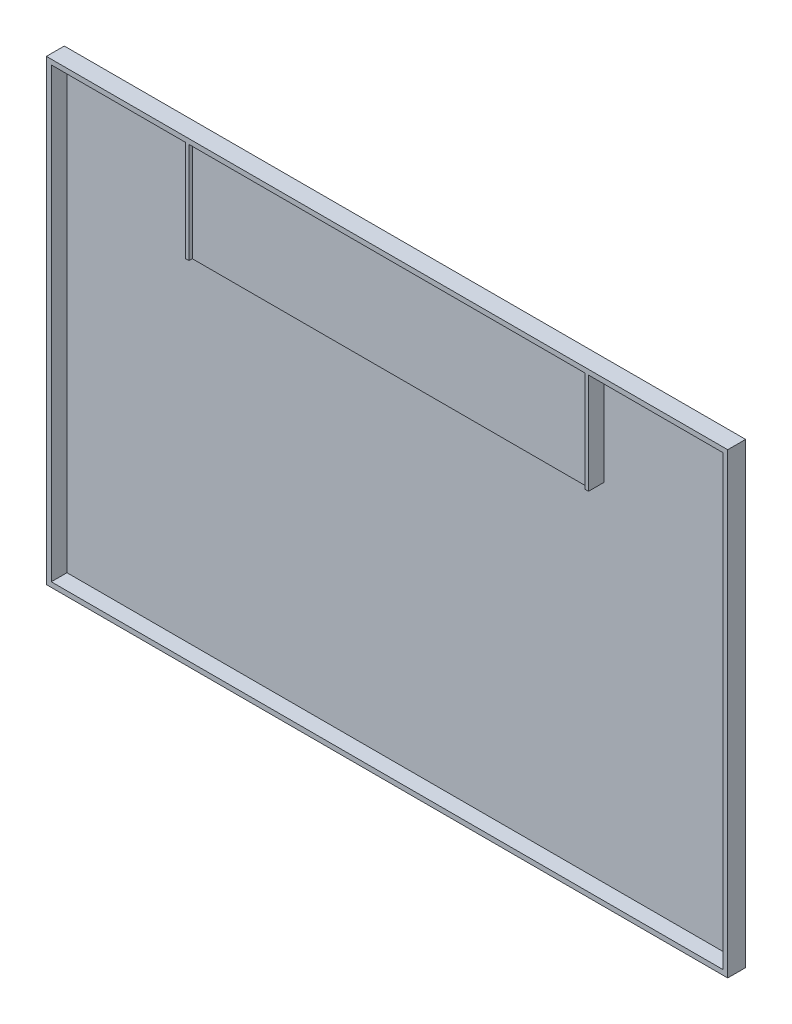
ISO-10303-21;
HEADER;
FILE_DESCRIPTION(('STEP AP214'),'2;1');
FILE_NAME('part.step','',(''),(''),'','','');
FILE_SCHEMA(('AUTOMOTIVE_DESIGN { 1 0 10303 214 1 1 1 1 }'));
ENDSEC;
DATA;
#1=APPLICATION_CONTEXT('core data for automotive mechanical design processes');
#2=APPLICATION_PROTOCOL_DEFINITION('international standard','automotive_design',2000,#1);
#3=PRODUCT_CONTEXT('',#1,'mechanical');
#4=PRODUCT('Part','Part','',(#3));
#5=PRODUCT_RELATED_PRODUCT_CATEGORY('part','',(#4));
#6=PRODUCT_DEFINITION_FORMATION('','',#4);
#7=PRODUCT_DEFINITION_CONTEXT('part definition',#1,'design');
#8=PRODUCT_DEFINITION('design','',#6,#7);
#9=PRODUCT_DEFINITION_SHAPE('','',#8);
#10=(LENGTH_UNIT() NAMED_UNIT(*) SI_UNIT(.MILLI.,.METRE.));
#11=(NAMED_UNIT(*) PLANE_ANGLE_UNIT() SI_UNIT($,.RADIAN.));
#12=(NAMED_UNIT(*) SI_UNIT($,.STERADIAN.) SOLID_ANGLE_UNIT());
#13=UNCERTAINTY_MEASURE_WITH_UNIT(LENGTH_MEASURE(1.E-05),#10,'distance_accuracy_value','');
#14=(GEOMETRIC_REPRESENTATION_CONTEXT(3) GLOBAL_UNCERTAINTY_ASSIGNED_CONTEXT((#13)) GLOBAL_UNIT_ASSIGNED_CONTEXT((#10,
#11,#12)) REPRESENTATION_CONTEXT('',''));
#15=CARTESIAN_POINT('',(0.,0.,0.));
#16=DIRECTION('',(0.,0.,1.));
#17=DIRECTION('',(1.,0.,0.));
#18=AXIS2_PLACEMENT_3D('',#15,#16,#17);
#19=CARTESIAN_POINT('',(0.,0.,80.));
#20=DIRECTION('',(0.,-1.,0.));
#21=DIRECTION('',(0.,0.,-1.));
#22=AXIS2_PLACEMENT_3D('',#19,#20,#21);
#23=PLANE('',#22);
#24=DIRECTION('',(-1.,0.,0.));
#25=VECTOR('',#24,1.);
#26=CARTESIAN_POINT('',(0.,0.,80.));
#27=LINE('',#26,#25);
#28=CARTESIAN_POINT('',(3000.,0.,80.));
#29=VERTEX_POINT('',#28);
#30=CARTESIAN_POINT('',(2400.00000000003,0.,80.));
#31=VERTEX_POINT('',#30);
#32=EDGE_CURVE('E223',#29,#31,#27,.T.);
#33=ORIENTED_EDGE('',*,*,#32,.T.);
#34=DIRECTION('',(0.,0.,-1.));
#35=VECTOR('',#34,1.);
#36=CARTESIAN_POINT('',(2400.00000000003,-8.10462807976364E-12,65.));
#37=LINE('',#36,#35);
#38=CARTESIAN_POINT('',(2400.00000000003,-8.10462807976364E-12,10.));
#39=VERTEX_POINT('',#38);
#40=EDGE_CURVE('E165',#31,#39,#37,.T.);
#41=ORIENTED_EDGE('',*,*,#40,.T.);
#42=DIRECTION('',(1.,0.,0.));
#43=VECTOR('',#42,1.);
#44=CARTESIAN_POINT('',(0.,0.,10.));
#45=LINE('',#44,#43);
#46=CARTESIAN_POINT('',(3000.,0.,9.99999999999999));
#47=VERTEX_POINT('',#46);
#48=EDGE_CURVE('E250',#39,#47,#45,.T.);
#49=ORIENTED_EDGE('',*,*,#48,.T.);
#50=DIRECTION('',(0.,0.,-1.));
#51=VECTOR('',#50,1.);
#52=CARTESIAN_POINT('',(3000.,0.,80.));
#53=LINE('',#52,#51);
#54=EDGE_CURVE('E229',#29,#47,#53,.T.);
#55=ORIENTED_EDGE('',*,*,#54,.F.);
#56=EDGE_LOOP('',(#33,#41,#49,#55));
#57=FACE_BOUND('',#56,.T.);
#58=ADVANCED_FACE('F42',(#57),#23,.T.);
#59=DIRECTION('',(-1.,0.,0.));
#60=VECTOR('',#59,1.);
#61=CARTESIAN_POINT('',(600.000000000028,-8.10462807976364E-12,65.));
#62=LINE('',#61,#60);
#63=CARTESIAN_POINT('',(2385.00000000003,-8.10462807976364E-12,65.));
#64=VERTEX_POINT('',#63);
#65=CARTESIAN_POINT('',(615.000000000028,0.,65.));
#66=VERTEX_POINT('',#65);
#67=EDGE_CURVE('E204',#64,#66,#62,.T.);
#68=ORIENTED_EDGE('',*,*,#67,.F.);
#69=DIRECTION('',(0.,0.,-1.));
#70=VECTOR('',#69,1.);
#71=CARTESIAN_POINT('',(2385.00000000003,0.,80.));
#72=LINE('',#71,#70);
#73=CARTESIAN_POINT('',(2385.00000000003,0.,80.));
#74=VERTEX_POINT('',#73);
#75=EDGE_CURVE('E64',#74,#64,#72,.T.);
#76=ORIENTED_EDGE('',*,*,#75,.F.);
#77=CARTESIAN_POINT('',(615.000000000028,0.,80.));
#78=VERTEX_POINT('',#77);
#79=EDGE_CURVE('E226',#74,#78,#27,.T.);
#80=ORIENTED_EDGE('',*,*,#79,.T.);
#81=DIRECTION('',(0.,0.,-1.));
#82=VECTOR('',#81,1.);
#83=CARTESIAN_POINT('',(615.000000000028,0.,80.));
#84=LINE('',#83,#82);
#85=EDGE_CURVE('E194',#78,#66,#84,.T.);
#86=ORIENTED_EDGE('',*,*,#85,.T.);
#87=EDGE_LOOP('',(#68,#76,#80,#86));
#88=FACE_BOUND('',#87,.T.);
#89=ADVANCED_FACE('F311',(#88),#23,.T.);
#90=CARTESIAN_POINT('',(0.,0.,65.));
#91=DIRECTION('',(0.,0.,1.));
#92=DIRECTION('',(1.,0.,0.));
#93=AXIS2_PLACEMENT_3D('',#90,#91,#92);
#94=PLANE('',#93);
#95=DIRECTION('',(1.,0.,0.));
#96=VECTOR('',#95,1.);
#97=CARTESIAN_POINT('',(600.000000000028,-450.000000000008,65.));
#98=LINE('',#97,#96);
#99=CARTESIAN_POINT('',(615.000000000028,-450.000000000008,65.));
#100=VERTEX_POINT('',#99);
#101=CARTESIAN_POINT('',(2385.00000000003,-450.000000000008,65.));
#102=VERTEX_POINT('',#101);
#103=EDGE_CURVE('E202',#100,#102,#98,.T.);
#104=ORIENTED_EDGE('',*,*,#103,.T.);
#105=DIRECTION('',(0.,-1.,0.));
#106=VECTOR('',#105,1.);
#107=CARTESIAN_POINT('',(2385.00000000003,-450.000000000008,65.));
#108=LINE('',#107,#106);
#109=EDGE_CURVE('E57',#64,#102,#108,.T.);
#110=ORIENTED_EDGE('',*,*,#109,.F.);
#111=ORIENTED_EDGE('',*,*,#67,.T.);
#112=DIRECTION('',(0.,1.,0.));
#113=VECTOR('',#112,1.);
#114=CARTESIAN_POINT('',(615.000000000028,-450.000000000008,65.));
#115=LINE('',#114,#113);
#116=EDGE_CURVE('E182',#100,#66,#115,.T.);
#117=ORIENTED_EDGE('',*,*,#116,.F.);
#118=EDGE_LOOP('',(#104,#110,#111,#117));
#119=FACE_BOUND('',#118,.T.);
#120=ADVANCED_FACE('F319',(#119),#94,.T.);
#121=DIRECTION('',(0.,0.,-1.));
#122=VECTOR('',#121,1.);
#123=CARTESIAN_POINT('',(600.000000000028,-8.10462807976364E-12,65.));
#124=LINE('',#123,#122);
#125=CARTESIAN_POINT('',(600.000000000028,0.,80.));
#126=VERTEX_POINT('',#125);
#127=CARTESIAN_POINT('',(600.000000000028,-8.10462807976364E-12,10.));
#128=VERTEX_POINT('',#127);
#129=EDGE_CURVE('E207',#126,#128,#124,.T.);
#130=ORIENTED_EDGE('',*,*,#129,.F.);
#131=CARTESIAN_POINT('',(0.,0.,80.));
#132=VERTEX_POINT('',#131);
#133=EDGE_CURVE('E222',#126,#132,#27,.T.);
#134=ORIENTED_EDGE('',*,*,#133,.T.);
#135=DIRECTION('',(0.,0.,-1.));
#136=VECTOR('',#135,1.);
#137=CARTESIAN_POINT('',(0.,0.,80.));
#138=LINE('',#137,#136);
#139=CARTESIAN_POINT('',(0.,0.,10.));
#140=VERTEX_POINT('',#139);
#141=EDGE_CURVE('E225',#132,#140,#138,.T.);
#142=ORIENTED_EDGE('',*,*,#141,.T.);
#143=EDGE_CURVE('E251',#140,#128,#45,.T.);
#144=ORIENTED_EDGE('',*,*,#143,.T.);
#145=EDGE_LOOP('',(#130,#134,#142,#144));
#146=FACE_BOUND('',#145,.T.);
#147=ADVANCED_FACE('F314',(#146),#23,.T.);
#148=CARTESIAN_POINT('',(0.,0.,10.));
#149=DIRECTION('',(0.,0.,1.));
#150=DIRECTION('',(1.,0.,0.));
#151=AXIS2_PLACEMENT_3D('',#148,#149,#150);
#152=PLANE('',#151);
#153=DIRECTION('',(1.,0.,0.));
#154=VECTOR('',#153,1.);
#155=CARTESIAN_POINT('',(600.000000000028,-450.000000000008,10.));
#156=LINE('',#155,#154);
#157=CARTESIAN_POINT('',(600.000000000028,-450.000000000008,10.));
#158=VERTEX_POINT('',#157);
#159=CARTESIAN_POINT('',(2400.00000000003,-450.000000000008,10.));
#160=VERTEX_POINT('',#159);
#161=EDGE_CURVE('E160',#158,#160,#156,.T.);
#162=ORIENTED_EDGE('',*,*,#161,.F.);
#163=DIRECTION('',(0.,-1.,0.));
#164=VECTOR('',#163,1.);
#165=CARTESIAN_POINT('',(600.000000000028,-8.10462807976364E-12,10.));
#166=LINE('',#165,#164);
#167=EDGE_CURVE('E201',#128,#158,#166,.T.);
#168=ORIENTED_EDGE('',*,*,#167,.F.);
#169=ORIENTED_EDGE('',*,*,#143,.F.);
#170=DIRECTION('',(0.,1.,0.));
#171=VECTOR('',#170,1.);
#172=CARTESIAN_POINT('',(0.,0.,10.));
#173=LINE('',#172,#171);
#174=CARTESIAN_POINT('',(2.44929357282144E-13,-2000.,10.));
#175=VERTEX_POINT('',#174);
#176=EDGE_CURVE('E260',#175,#140,#173,.T.);
#177=ORIENTED_EDGE('',*,*,#176,.F.);
#178=DIRECTION('',(-1.,0.,0.));
#179=VECTOR('',#178,1.);
#180=CARTESIAN_POINT('',(0.,-2000.,10.));
#181=LINE('',#180,#179);
#182=CARTESIAN_POINT('',(3000.,-2000.,10.));
#183=VERTEX_POINT('',#182);
#184=EDGE_CURVE('E257',#183,#175,#181,.T.);
#185=ORIENTED_EDGE('',*,*,#184,.F.);
#186=DIRECTION('',(0.,-1.,0.));
#187=VECTOR('',#186,1.);
#188=CARTESIAN_POINT('',(3000.,6.66133814775094E-13,10.));
#189=LINE('',#188,#187);
#190=EDGE_CURVE('E254',#47,#183,#189,.T.);
#191=ORIENTED_EDGE('',*,*,#190,.F.);
#192=ORIENTED_EDGE('',*,*,#48,.F.);
#193=DIRECTION('',(0.,1.,0.));
#194=VECTOR('',#193,1.);
#195=CARTESIAN_POINT('',(2400.00000000003,-8.10462807976364E-12,10.));
#196=LINE('',#195,#194);
#197=EDGE_CURVE('E205',#160,#39,#196,.T.);
#198=ORIENTED_EDGE('',*,*,#197,.F.);
#199=EDGE_LOOP('',(#162,#168,#169,#177,#185,#191,#192,#198));
#200=FACE_BOUND('',#199,.T.);
#201=ADVANCED_FACE('F323',(#200),#152,.T.);
#202=CARTESIAN_POINT('',(3022.,1.31314832893042E-12,10.));
#203=DIRECTION('',(1.,0.,0.));
#204=DIRECTION('',(0.,1.,0.));
#205=AXIS2_PLACEMENT_3D('',#202,#203,#204);
#206=PLANE('',#205);
#207=DIRECTION('',(0.,-1.,0.));
#208=VECTOR('',#207,1.);
#209=CARTESIAN_POINT('',(3022.,1.31314832893042E-12,0.));
#210=LINE('',#209,#208);
#211=CARTESIAN_POINT('',(3022.,22.,0.));
#212=VERTEX_POINT('',#211);
#213=CARTESIAN_POINT('',(3022.,-2022.,0.));
#214=VERTEX_POINT('',#213);
#215=EDGE_CURVE('E263',#212,#214,#210,.T.);
#216=ORIENTED_EDGE('',*,*,#215,.F.);
#217=DIRECTION('',(0.,0.,-1.));
#218=VECTOR('',#217,1.);
#219=CARTESIAN_POINT('',(3022.,22.,10.));
#220=LINE('',#219,#218);
#221=CARTESIAN_POINT('',(3022.,22.,80.));
#222=VERTEX_POINT('',#221);
#223=EDGE_CURVE('E11',#222,#212,#220,.T.);
#224=ORIENTED_EDGE('',*,*,#223,.F.);
#225=DIRECTION('',(0.,1.,0.));
#226=VECTOR('',#225,1.);
#227=CARTESIAN_POINT('',(3022.,22.,80.));
#228=LINE('',#227,#226);
#229=CARTESIAN_POINT('',(3022.,-2022.,80.));
#230=VERTEX_POINT('',#229);
#231=EDGE_CURVE('E244',#230,#222,#228,.T.);
#232=ORIENTED_EDGE('',*,*,#231,.F.);
#233=DIRECTION('',(0.,0.,-1.));
#234=VECTOR('',#233,1.);
#235=CARTESIAN_POINT('',(3022.,-2022.,10.));
#236=LINE('',#235,#234);
#237=EDGE_CURVE('E274',#230,#214,#236,.T.);
#238=ORIENTED_EDGE('',*,*,#237,.T.);
#239=EDGE_LOOP('',(#216,#224,#232,#238));
#240=FACE_BOUND('',#239,.T.);
#241=ADVANCED_FACE('F44',(#240),#206,.T.);
#242=CARTESIAN_POINT('',(0.,22.,10.));
#243=DIRECTION('',(0.,1.,0.));
#244=DIRECTION('',(-1.,0.,0.));
#245=AXIS2_PLACEMENT_3D('',#242,#243,#244);
#246=PLANE('',#245);
#247=DIRECTION('',(1.,0.,0.));
#248=VECTOR('',#247,1.);
#249=CARTESIAN_POINT('',(0.,22.,0.));
#250=LINE('',#249,#248);
#251=CARTESIAN_POINT('',(-22.,22.,0.));
#252=VERTEX_POINT('',#251);
#253=EDGE_CURVE('E266',#252,#212,#250,.T.);
#254=ORIENTED_EDGE('',*,*,#253,.F.);
#255=DIRECTION('',(0.,0.,-1.));
#256=VECTOR('',#255,1.);
#257=CARTESIAN_POINT('',(-22.,22.,10.));
#258=LINE('',#257,#256);
#259=CARTESIAN_POINT('',(-22.,22.,80.));
#260=VERTEX_POINT('',#259);
#261=EDGE_CURVE('E50',#260,#252,#258,.T.);
#262=ORIENTED_EDGE('',*,*,#261,.F.);
#263=DIRECTION('',(-1.,0.,0.));
#264=VECTOR('',#263,1.);
#265=CARTESIAN_POINT('',(-22.,22.,80.));
#266=LINE('',#265,#264);
#267=EDGE_CURVE('E247',#222,#260,#266,.T.);
#268=ORIENTED_EDGE('',*,*,#267,.F.);
#269=ORIENTED_EDGE('',*,*,#223,.T.);
#270=EDGE_LOOP('',(#254,#262,#268,#269));
#271=FACE_BOUND('',#270,.T.);
#272=ADVANCED_FACE('F288',(#271),#246,.T.);
#273=CARTESIAN_POINT('',(-22.,0.,10.));
#274=DIRECTION('',(1.,0.,0.));
#275=DIRECTION('',(0.,1.,0.));
#276=AXIS2_PLACEMENT_3D('',#273,#274,#275);
#277=PLANE('',#276);
#278=DIRECTION('',(0.,-1.,0.));
#279=VECTOR('',#278,1.);
#280=CARTESIAN_POINT('',(-22.,0.,0.));
#281=LINE('',#280,#279);
#282=CARTESIAN_POINT('',(-21.9999999999998,-2022.,0.));
#283=VERTEX_POINT('',#282);
#284=EDGE_CURVE('E269',#252,#283,#281,.T.);
#285=ORIENTED_EDGE('',*,*,#284,.T.);
#286=DIRECTION('',(0.,0.,-1.));
#287=VECTOR('',#286,1.);
#288=CARTESIAN_POINT('',(-21.9999999999998,-2022.,10.));
#289=LINE('',#288,#287);
#290=CARTESIAN_POINT('',(-21.9999999999998,-2022.,80.));
#291=VERTEX_POINT('',#290);
#292=EDGE_CURVE('E276',#291,#283,#289,.T.);
#293=ORIENTED_EDGE('',*,*,#292,.F.);
#294=DIRECTION('',(0.,-1.,0.));
#295=VECTOR('',#294,1.);
#296=CARTESIAN_POINT('',(-22.,22.,80.));
#297=LINE('',#296,#295);
#298=EDGE_CURVE('E238',#260,#291,#297,.T.);
#299=ORIENTED_EDGE('',*,*,#298,.F.);
#300=ORIENTED_EDGE('',*,*,#261,.T.);
#301=EDGE_LOOP('',(#285,#293,#299,#300));
#302=FACE_BOUND('',#301,.T.);
#303=ADVANCED_FACE('F281',(#302),#277,.F.);
#304=CARTESIAN_POINT('',(0.,-2022.,10.));
#305=DIRECTION('',(0.,1.,0.));
#306=DIRECTION('',(0.,0.,1.));
#307=AXIS2_PLACEMENT_3D('',#304,#305,#306);
#308=PLANE('',#307);
#309=DIRECTION('',(1.,0.,0.));
#310=VECTOR('',#309,1.);
#311=CARTESIAN_POINT('',(0.,-2022.,0.));
#312=LINE('',#311,#310);
#313=EDGE_CURVE('E271',#283,#214,#312,.T.);
#314=ORIENTED_EDGE('',*,*,#313,.T.);
#315=ORIENTED_EDGE('',*,*,#237,.F.);
#316=DIRECTION('',(1.,0.,0.));
#317=VECTOR('',#316,1.);
#318=CARTESIAN_POINT('',(-21.9999999999998,-2022.,80.));
#319=LINE('',#318,#317);
#320=EDGE_CURVE('E241',#291,#230,#319,.T.);
#321=ORIENTED_EDGE('',*,*,#320,.F.);
#322=ORIENTED_EDGE('',*,*,#292,.T.);
#323=EDGE_LOOP('',(#314,#315,#321,#322));
#324=FACE_BOUND('',#323,.T.);
#325=ADVANCED_FACE('F294',(#324),#308,.F.);
#326=CARTESIAN_POINT('',(0.,0.,0.));
#327=DIRECTION('',(0.,0.,1.));
#328=DIRECTION('',(1.,0.,0.));
#329=AXIS2_PLACEMENT_3D('',#326,#327,#328);
#330=PLANE('',#329);
#331=ORIENTED_EDGE('',*,*,#215,.T.);
#332=ORIENTED_EDGE('',*,*,#313,.F.);
#333=ORIENTED_EDGE('',*,*,#284,.F.);
#334=ORIENTED_EDGE('',*,*,#253,.T.);
#335=EDGE_LOOP('',(#331,#332,#333,#334));
#336=FACE_BOUND('',#335,.T.);
#337=ADVANCED_FACE('F287',(#336),#330,.F.);
#338=CARTESIAN_POINT('',(0.,0.,80.));
#339=DIRECTION('',(0.,0.,1.));
#340=DIRECTION('',(1.,0.,0.));
#341=AXIS2_PLACEMENT_3D('',#338,#339,#340);
#342=PLANE('',#341);
#343=ORIENTED_EDGE('',*,*,#298,.T.);
#344=ORIENTED_EDGE('',*,*,#320,.T.);
#345=ORIENTED_EDGE('',*,*,#231,.T.);
#346=ORIENTED_EDGE('',*,*,#267,.T.);
#347=EDGE_LOOP('',(#343,#344,#345,#346));
#348=FACE_BOUND('',#347,.T.);
#349=DIRECTION('',(1.,0.,0.));
#350=VECTOR('',#349,1.);
#351=CARTESIAN_POINT('',(2.44929359829471E-13,-2000.,80.));
#352=LINE('',#351,#350);
#353=CARTESIAN_POINT('',(2.44929359829471E-13,-2000.,80.));
#354=VERTEX_POINT('',#353);
#355=CARTESIAN_POINT('',(3000.,-2000.,80.));
#356=VERTEX_POINT('',#355);
#357=EDGE_CURVE('E217',#354,#356,#352,.T.);
#358=ORIENTED_EDGE('',*,*,#357,.F.);
#359=DIRECTION('',(0.,-1.,0.));
#360=VECTOR('',#359,1.);
#361=CARTESIAN_POINT('',(0.,0.,80.));
#362=LINE('',#361,#360);
#363=EDGE_CURVE('E215',#132,#354,#362,.T.);
#364=ORIENTED_EDGE('',*,*,#363,.F.);
#365=ORIENTED_EDGE('',*,*,#133,.F.);
#366=DIRECTION('',(0.,-1.,0.));
#367=VECTOR('',#366,1.);
#368=CARTESIAN_POINT('',(600.000000000028,-450.000000000008,80.));
#369=LINE('',#368,#367);
#370=CARTESIAN_POINT('',(600.000000000028,-450.000000000008,80.));
#371=VERTEX_POINT('',#370);
#372=EDGE_CURVE('E186',#126,#371,#369,.T.);
#373=ORIENTED_EDGE('',*,*,#372,.T.);
#374=DIRECTION('',(1.,0.,0.));
#375=VECTOR('',#374,1.);
#376=CARTESIAN_POINT('',(600.000000000028,-450.000000000008,80.));
#377=LINE('',#376,#375);
#378=CARTESIAN_POINT('',(615.000000000028,-450.000000000008,80.));
#379=VERTEX_POINT('',#378);
#380=EDGE_CURVE('E189',#371,#379,#377,.T.);
#381=ORIENTED_EDGE('',*,*,#380,.T.);
#382=DIRECTION('',(0.,1.,0.));
#383=VECTOR('',#382,1.);
#384=CARTESIAN_POINT('',(615.000000000028,-450.000000000008,80.));
#385=LINE('',#384,#383);
#386=EDGE_CURVE('E191',#379,#78,#385,.T.);
#387=ORIENTED_EDGE('',*,*,#386,.T.);
#388=ORIENTED_EDGE('',*,*,#79,.F.);
#389=DIRECTION('',(0.,-1.,0.));
#390=VECTOR('',#389,1.);
#391=CARTESIAN_POINT('',(2385.00000000003,-450.000000000008,80.));
#392=LINE('',#391,#390);
#393=CARTESIAN_POINT('',(2385.00000000003,-450.000000000008,80.));
#394=VERTEX_POINT('',#393);
#395=EDGE_CURVE('E174',#74,#394,#392,.T.);
#396=ORIENTED_EDGE('',*,*,#395,.T.);
#397=DIRECTION('',(1.,0.,0.));
#398=VECTOR('',#397,1.);
#399=CARTESIAN_POINT('',(2400.00000000003,-450.000000000008,80.));
#400=LINE('',#399,#398);
#401=CARTESIAN_POINT('',(2400.00000000003,-450.000000000008,80.));
#402=VERTEX_POINT('',#401);
#403=EDGE_CURVE('E158',#394,#402,#400,.T.);
#404=ORIENTED_EDGE('',*,*,#403,.T.);
#405=DIRECTION('',(0.,1.,0.));
#406=VECTOR('',#405,1.);
#407=CARTESIAN_POINT('',(2400.00000000003,-450.000000000008,80.));
#408=LINE('',#407,#406);
#409=EDGE_CURVE('E172',#402,#31,#408,.T.);
#410=ORIENTED_EDGE('',*,*,#409,.T.);
#411=ORIENTED_EDGE('',*,*,#32,.F.);
#412=DIRECTION('',(0.,1.,0.));
#413=VECTOR('',#412,1.);
#414=CARTESIAN_POINT('',(3000.,0.,80.));
#415=LINE('',#414,#413);
#416=EDGE_CURVE('E219',#356,#29,#415,.T.);
#417=ORIENTED_EDGE('',*,*,#416,.F.);
#418=EDGE_LOOP('',(#358,#364,#365,#373,#381,#387,#388,#396,#404,#410,#411,#417));
#419=FACE_BOUND('',#418,.T.);
#420=ADVANCED_FACE('F170',(#348,#419),#342,.T.);
#421=CARTESIAN_POINT('',(0.,0.,80.));
#422=DIRECTION('',(1.,0.,0.));
#423=DIRECTION('',(0.,1.,0.));
#424=AXIS2_PLACEMENT_3D('',#421,#422,#423);
#425=PLANE('',#424);
#426=DIRECTION('',(0.,0.,-1.));
#427=VECTOR('',#426,1.);
#428=CARTESIAN_POINT('',(2.44929359829471E-13,-2000.,80.));
#429=LINE('',#428,#427);
#430=EDGE_CURVE('E235',#354,#175,#429,.T.);
#431=ORIENTED_EDGE('',*,*,#430,.T.);
#432=ORIENTED_EDGE('',*,*,#176,.T.);
#433=ORIENTED_EDGE('',*,*,#141,.F.);
#434=ORIENTED_EDGE('',*,*,#363,.T.);
#435=EDGE_LOOP('',(#431,#432,#433,#434));
#436=FACE_BOUND('',#435,.T.);
#437=ADVANCED_FACE('F297',(#436),#425,.T.);
#438=CARTESIAN_POINT('',(2.44929359829471E-13,-2000.,80.));
#439=DIRECTION('',(0.,1.,0.));
#440=DIRECTION('',(0.,0.,1.));
#441=AXIS2_PLACEMENT_3D('',#438,#439,#440);
#442=PLANE('',#441);
#443=DIRECTION('',(0.,0.,-1.));
#444=VECTOR('',#443,1.);
#445=CARTESIAN_POINT('',(3000.,-2000.,80.));
#446=LINE('',#445,#444);
#447=EDGE_CURVE('E232',#356,#183,#446,.T.);
#448=ORIENTED_EDGE('',*,*,#447,.T.);
#449=ORIENTED_EDGE('',*,*,#184,.T.);
#450=ORIENTED_EDGE('',*,*,#430,.F.);
#451=ORIENTED_EDGE('',*,*,#357,.T.);
#452=EDGE_LOOP('',(#448,#449,#450,#451));
#453=FACE_BOUND('',#452,.T.);
#454=ADVANCED_FACE('F304',(#453),#442,.T.);
#455=CARTESIAN_POINT('',(3000.,0.,80.));
#456=DIRECTION('',(-1.,0.,0.));
#457=DIRECTION('',(0.,-1.,0.));
#458=AXIS2_PLACEMENT_3D('',#455,#456,#457);
#459=PLANE('',#458);
#460=ORIENTED_EDGE('',*,*,#54,.T.);
#461=ORIENTED_EDGE('',*,*,#190,.T.);
#462=ORIENTED_EDGE('',*,*,#447,.F.);
#463=ORIENTED_EDGE('',*,*,#416,.T.);
#464=EDGE_LOOP('',(#460,#461,#462,#463));
#465=FACE_BOUND('',#464,.T.);
#466=ADVANCED_FACE('F359',(#465),#459,.T.);
#467=CARTESIAN_POINT('',(600.000000000028,-8.10462807976364E-12,65.));
#468=DIRECTION('',(1.,0.,0.));
#469=DIRECTION('',(0.,0.,-1.));
#470=AXIS2_PLACEMENT_3D('',#467,#468,#469);
#471=PLANE('',#470);
#472=ORIENTED_EDGE('',*,*,#167,.T.);
#473=DIRECTION('',(0.,0.,-1.));
#474=VECTOR('',#473,1.);
#475=CARTESIAN_POINT('',(600.000000000028,-450.000000000008,65.));
#476=LINE('',#475,#474);
#477=EDGE_CURVE('E164',#371,#158,#476,.T.);
#478=ORIENTED_EDGE('',*,*,#477,.F.);
#479=ORIENTED_EDGE('',*,*,#372,.F.);
#480=ORIENTED_EDGE('',*,*,#129,.T.);
#481=EDGE_LOOP('',(#472,#478,#479,#480));
#482=FACE_BOUND('',#481,.T.);
#483=ADVANCED_FACE('F335',(#482),#471,.F.);
#484=CARTESIAN_POINT('',(600.000000000028,-450.000000000008,65.));
#485=DIRECTION('',(0.,1.,0.));
#486=DIRECTION('',(0.,0.,1.));
#487=AXIS2_PLACEMENT_3D('',#484,#485,#486);
#488=PLANE('',#487);
#489=ORIENTED_EDGE('',*,*,#161,.T.);
#490=DIRECTION('',(0.,0.,-1.));
#491=VECTOR('',#490,1.);
#492=CARTESIAN_POINT('',(2400.00000000003,-450.000000000008,65.));
#493=LINE('',#492,#491);
#494=EDGE_CURVE('E154',#402,#160,#493,.T.);
#495=ORIENTED_EDGE('',*,*,#494,.F.);
#496=ORIENTED_EDGE('',*,*,#403,.F.);
#497=DIRECTION('',(0.,0.,-1.));
#498=VECTOR('',#497,1.);
#499=CARTESIAN_POINT('',(2385.00000000003,-450.000000000008,80.));
#500=LINE('',#499,#498);
#501=EDGE_CURVE('E176',#394,#102,#500,.T.);
#502=ORIENTED_EDGE('',*,*,#501,.T.);
#503=ORIENTED_EDGE('',*,*,#103,.F.);
#504=DIRECTION('',(0.,0.,-1.));
#505=VECTOR('',#504,1.);
#506=CARTESIAN_POINT('',(615.000000000028,-450.000000000008,80.));
#507=LINE('',#506,#505);
#508=EDGE_CURVE('E199',#379,#100,#507,.T.);
#509=ORIENTED_EDGE('',*,*,#508,.F.);
#510=ORIENTED_EDGE('',*,*,#380,.F.);
#511=ORIENTED_EDGE('',*,*,#477,.T.);
#512=EDGE_LOOP('',(#489,#495,#496,#502,#503,#509,#510,#511));
#513=FACE_BOUND('',#512,.T.);
#514=ADVANCED_FACE('F156',(#513),#488,.F.);
#515=CARTESIAN_POINT('',(2400.00000000003,-8.10462807976364E-12,65.));
#516=DIRECTION('',(-1.,0.,0.));
#517=DIRECTION('',(0.,0.,1.));
#518=AXIS2_PLACEMENT_3D('',#515,#516,#517);
#519=PLANE('',#518);
#520=ORIENTED_EDGE('',*,*,#197,.T.);
#521=ORIENTED_EDGE('',*,*,#40,.F.);
#522=ORIENTED_EDGE('',*,*,#409,.F.);
#523=ORIENTED_EDGE('',*,*,#494,.T.);
#524=EDGE_LOOP('',(#520,#521,#522,#523));
#525=FACE_BOUND('',#524,.T.);
#526=ADVANCED_FACE('F178',(#525),#519,.F.);
#527=CARTESIAN_POINT('',(615.000000000028,-450.000000000008,80.));
#528=DIRECTION('',(-1.,0.,0.));
#529=DIRECTION('',(0.,0.,1.));
#530=AXIS2_PLACEMENT_3D('',#527,#528,#529);
#531=PLANE('',#530);
#532=ORIENTED_EDGE('',*,*,#116,.T.);
#533=ORIENTED_EDGE('',*,*,#85,.F.);
#534=ORIENTED_EDGE('',*,*,#386,.F.);
#535=ORIENTED_EDGE('',*,*,#508,.T.);
#536=EDGE_LOOP('',(#532,#533,#534,#535));
#537=FACE_BOUND('',#536,.T.);
#538=ADVANCED_FACE('F342',(#537),#531,.F.);
#539=CARTESIAN_POINT('',(2385.00000000003,-450.000000000008,80.));
#540=DIRECTION('',(1.,0.,0.));
#541=DIRECTION('',(0.,0.,-1.));
#542=AXIS2_PLACEMENT_3D('',#539,#540,#541);
#543=PLANE('',#542);
#544=ORIENTED_EDGE('',*,*,#109,.T.);
#545=ORIENTED_EDGE('',*,*,#501,.F.);
#546=ORIENTED_EDGE('',*,*,#395,.F.);
#547=ORIENTED_EDGE('',*,*,#75,.T.);
#548=EDGE_LOOP('',(#544,#545,#546,#547));
#549=FACE_BOUND('',#548,.T.);
#550=ADVANCED_FACE('F348',(#549),#543,.F.);
#551=CLOSED_SHELL('',(#58,#89,#120,#147,#201,#241,#272,#303,#325,#337,#420,#437,#454,#466,#483,
#514,#526,#538,#550));
#552=MANIFOLD_SOLID_BREP('B2',#551);
#553=ADVANCED_BREP_SHAPE_REPRESENTATION('',(#18,#552),#14);
#554=SHAPE_DEFINITION_REPRESENTATION(#9,#553);
ENDSEC;
END-ISO-10303-21;
